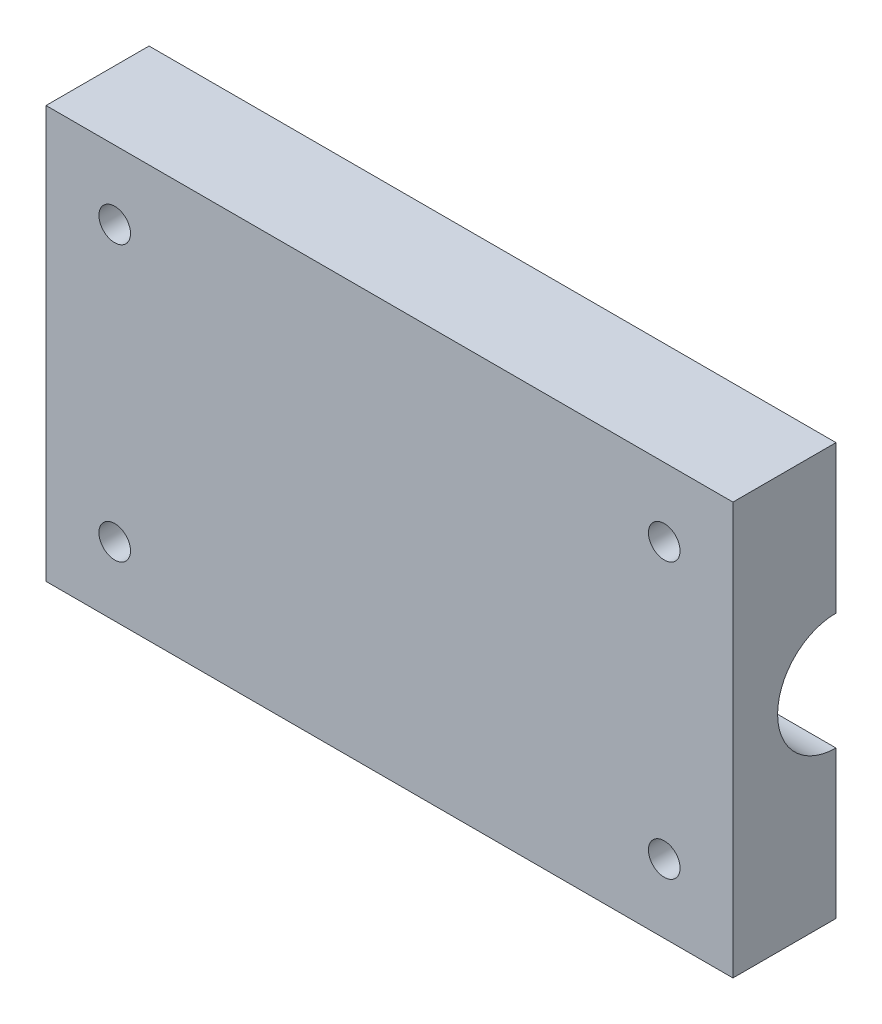
ISO-10303-21;
HEADER;
FILE_DESCRIPTION(('STEP AP214'),'2;1');
FILE_NAME('part.step','',(''),(''),'','','');
FILE_SCHEMA(('AUTOMOTIVE_DESIGN { 1 0 10303 214 1 1 1 1 }'));
ENDSEC;
DATA;
#1=APPLICATION_CONTEXT('core data for automotive mechanical design processes');
#2=APPLICATION_PROTOCOL_DEFINITION('international standard','automotive_design',2000,#1);
#3=PRODUCT_CONTEXT('',#1,'mechanical');
#4=PRODUCT('Part','Part','',(#3));
#5=PRODUCT_RELATED_PRODUCT_CATEGORY('part','',(#4));
#6=PRODUCT_DEFINITION_FORMATION('','',#4);
#7=PRODUCT_DEFINITION_CONTEXT('part definition',#1,'design');
#8=PRODUCT_DEFINITION('design','',#6,#7);
#9=PRODUCT_DEFINITION_SHAPE('','',#8);
#10=(LENGTH_UNIT() NAMED_UNIT(*) SI_UNIT(.MILLI.,.METRE.));
#11=(NAMED_UNIT(*) PLANE_ANGLE_UNIT() SI_UNIT($,.RADIAN.));
#12=(NAMED_UNIT(*) SI_UNIT($,.STERADIAN.) SOLID_ANGLE_UNIT());
#13=UNCERTAINTY_MEASURE_WITH_UNIT(LENGTH_MEASURE(1.E-05),#10,'distance_accuracy_value','');
#14=(GEOMETRIC_REPRESENTATION_CONTEXT(3) GLOBAL_UNCERTAINTY_ASSIGNED_CONTEXT((#13)) GLOBAL_UNIT_ASSIGNED_CONTEXT((#10,
#11,#12)) REPRESENTATION_CONTEXT('',''));
#15=CARTESIAN_POINT('',(0.,0.,0.));
#16=DIRECTION('',(0.,0.,1.));
#17=DIRECTION('',(1.,0.,0.));
#18=AXIS2_PLACEMENT_3D('',#15,#16,#17);
#19=CARTESIAN_POINT('',(0.,0.,0.));
#20=DIRECTION('',(0.,0.,1.));
#21=DIRECTION('',(1.,0.,0.));
#22=AXIS2_PLACEMENT_3D('',#19,#20,#21);
#23=PLANE('',#22);
#24=CARTESIAN_POINT('',(-40.,20.,0.));
#25=DIRECTION('',(0.,0.,1.));
#26=DIRECTION('',(-1.,0.,0.));
#27=AXIS2_PLACEMENT_3D('',#24,#25,#26);
#28=CIRCLE('',#27,2.3);
#29=CARTESIAN_POINT('',(-42.3,20.,0.));
#30=VERTEX_POINT('',#29);
#31=EDGE_CURVE('E189',#30,#30,#28,.T.);
#32=ORIENTED_EDGE('',*,*,#31,.T.);
#33=EDGE_LOOP('',(#32));
#34=FACE_BOUND('',#33,.T.);
#35=CARTESIAN_POINT('',(40.,20.,0.));
#36=DIRECTION('',(0.,0.,1.));
#37=DIRECTION('',(1.,0.,0.));
#38=AXIS2_PLACEMENT_3D('',#35,#36,#37);
#39=CIRCLE('',#38,2.3);
#40=CARTESIAN_POINT('',(42.3,20.,0.));
#41=VERTEX_POINT('',#40);
#42=EDGE_CURVE('E181',#41,#41,#39,.T.);
#43=ORIENTED_EDGE('',*,*,#42,.T.);
#44=EDGE_LOOP('',(#43));
#45=FACE_BOUND('',#44,.T.);
#46=DIRECTION('',(0.,1.,0.));
#47=VECTOR('',#46,1.);
#48=CARTESIAN_POINT('',(50.,30.,0.));
#49=LINE('',#48,#47);
#50=CARTESIAN_POINT('',(50.,8.5,0.));
#51=VERTEX_POINT('',#50);
#52=CARTESIAN_POINT('',(50.,30.,0.));
#53=VERTEX_POINT('',#52);
#54=EDGE_CURVE('E117',#51,#53,#49,.T.);
#55=ORIENTED_EDGE('',*,*,#54,.F.);
#56=DIRECTION('',(-1.,0.,0.));
#57=VECTOR('',#56,1.);
#58=CARTESIAN_POINT('',(150.,8.5,0.));
#59=LINE('',#58,#57);
#60=CARTESIAN_POINT('',(-50.,8.5,0.));
#61=VERTEX_POINT('',#60);
#62=EDGE_CURVE('E107',#51,#61,#59,.T.);
#63=ORIENTED_EDGE('',*,*,#62,.T.);
#64=DIRECTION('',(0.,-1.,0.));
#65=VECTOR('',#64,1.);
#66=CARTESIAN_POINT('',(-50.,30.,0.));
#67=LINE('',#66,#65);
#68=CARTESIAN_POINT('',(-50.,30.,0.));
#69=VERTEX_POINT('',#68);
#70=EDGE_CURVE('E116',#69,#61,#67,.T.);
#71=ORIENTED_EDGE('',*,*,#70,.F.);
#72=DIRECTION('',(-1.,0.,0.));
#73=VECTOR('',#72,1.);
#74=CARTESIAN_POINT('',(-50.,30.,0.));
#75=LINE('',#74,#73);
#76=EDGE_CURVE('E132',#53,#69,#75,.T.);
#77=ORIENTED_EDGE('',*,*,#76,.F.);
#78=EDGE_LOOP('',(#55,#63,#71,#77));
#79=FACE_BOUND('',#78,.T.);
#80=ADVANCED_FACE('F45',(#34,#45,#79),#23,.F.);
#81=CARTESIAN_POINT('',(0.,0.,15.));
#82=DIRECTION('',(0.,0.,1.));
#83=DIRECTION('',(1.,0.,0.));
#84=AXIS2_PLACEMENT_3D('',#81,#82,#83);
#85=PLANE('',#84);
#86=CARTESIAN_POINT('',(40.,20.,15.));
#87=DIRECTION('',(0.,0.,1.));
#88=DIRECTION('',(1.,0.,0.));
#89=AXIS2_PLACEMENT_3D('',#86,#87,#88);
#90=CIRCLE('',#89,2.3);
#91=CARTESIAN_POINT('',(42.3,20.,15.));
#92=VERTEX_POINT('',#91);
#93=EDGE_CURVE('E177',#92,#92,#90,.T.);
#94=ORIENTED_EDGE('',*,*,#93,.F.);
#95=EDGE_LOOP('',(#94));
#96=FACE_BOUND('',#95,.T.);
#97=CARTESIAN_POINT('',(-40.,-20.,15.));
#98=DIRECTION('',(0.,0.,1.));
#99=DIRECTION('',(1.,0.,0.));
#100=AXIS2_PLACEMENT_3D('',#97,#98,#99);
#101=CIRCLE('',#100,2.3);
#102=CARTESIAN_POINT('',(-37.7,-20.,15.));
#103=VERTEX_POINT('',#102);
#104=EDGE_CURVE('E151',#103,#103,#101,.T.);
#105=ORIENTED_EDGE('',*,*,#104,.F.);
#106=EDGE_LOOP('',(#105));
#107=FACE_BOUND('',#106,.T.);
#108=DIRECTION('',(0.,1.,0.));
#109=VECTOR('',#108,1.);
#110=CARTESIAN_POINT('',(50.,30.,15.));
#111=LINE('',#110,#109);
#112=CARTESIAN_POINT('',(50.,-30.,15.));
#113=VERTEX_POINT('',#112);
#114=CARTESIAN_POINT('',(50.,30.,15.));
#115=VERTEX_POINT('',#114);
#116=EDGE_CURVE('E130',#113,#115,#111,.T.);
#117=ORIENTED_EDGE('',*,*,#116,.T.);
#118=DIRECTION('',(-1.,0.,0.));
#119=VECTOR('',#118,1.);
#120=CARTESIAN_POINT('',(-50.,30.,15.));
#121=LINE('',#120,#119);
#122=CARTESIAN_POINT('',(-50.,30.,15.));
#123=VERTEX_POINT('',#122);
#124=EDGE_CURVE('E98',#115,#123,#121,.T.);
#125=ORIENTED_EDGE('',*,*,#124,.T.);
#126=DIRECTION('',(0.,-1.,0.));
#127=VECTOR('',#126,1.);
#128=CARTESIAN_POINT('',(-50.,30.,15.));
#129=LINE('',#128,#127);
#130=CARTESIAN_POINT('',(-50.,-30.,15.));
#131=VERTEX_POINT('',#130);
#132=EDGE_CURVE('E158',#123,#131,#129,.T.);
#133=ORIENTED_EDGE('',*,*,#132,.T.);
#134=DIRECTION('',(1.,0.,0.));
#135=VECTOR('',#134,1.);
#136=CARTESIAN_POINT('',(-50.,-30.,15.));
#137=LINE('',#136,#135);
#138=EDGE_CURVE('E69',#131,#113,#137,.T.);
#139=ORIENTED_EDGE('',*,*,#138,.T.);
#140=EDGE_LOOP('',(#117,#125,#133,#139));
#141=FACE_BOUND('',#140,.T.);
#142=CARTESIAN_POINT('',(40.,-20.,15.));
#143=DIRECTION('',(0.,0.,1.));
#144=DIRECTION('',(-1.,0.,0.));
#145=AXIS2_PLACEMENT_3D('',#142,#143,#144);
#146=CIRCLE('',#145,2.3);
#147=CARTESIAN_POINT('',(37.7,-20.,15.));
#148=VERTEX_POINT('',#147);
#149=EDGE_CURVE('E169',#148,#148,#146,.T.);
#150=ORIENTED_EDGE('',*,*,#149,.F.);
#151=EDGE_LOOP('',(#150));
#152=FACE_BOUND('',#151,.T.);
#153=CARTESIAN_POINT('',(-40.,20.,15.));
#154=DIRECTION('',(0.,0.,1.));
#155=DIRECTION('',(-1.,0.,0.));
#156=AXIS2_PLACEMENT_3D('',#153,#154,#155);
#157=CIRCLE('',#156,2.3);
#158=CARTESIAN_POINT('',(-42.3,20.,15.));
#159=VERTEX_POINT('',#158);
#160=EDGE_CURVE('E185',#159,#159,#157,.T.);
#161=ORIENTED_EDGE('',*,*,#160,.F.);
#162=EDGE_LOOP('',(#161));
#163=FACE_BOUND('',#162,.T.);
#164=ADVANCED_FACE('F218',(#96,#107,#141,#152,#163),#85,.T.);
#165=CARTESIAN_POINT('',(-50.,-8.5,0.));
#166=VERTEX_POINT('',#165);
#167=CARTESIAN_POINT('',(-50.,-30.,0.));
#168=VERTEX_POINT('',#167);
#169=EDGE_CURVE('E126',#166,#168,#67,.T.);
#170=ORIENTED_EDGE('',*,*,#169,.F.);
#171=DIRECTION('',(-1.,0.,0.));
#172=VECTOR('',#171,1.);
#173=CARTESIAN_POINT('',(150.,-8.5,0.));
#174=LINE('',#173,#172);
#175=CARTESIAN_POINT('',(50.,-8.5,0.));
#176=VERTEX_POINT('',#175);
#177=EDGE_CURVE('E61',#166,#176,#174,.F.);
#178=ORIENTED_EDGE('',*,*,#177,.T.);
#179=CARTESIAN_POINT('',(50.,-30.,0.));
#180=VERTEX_POINT('',#179);
#181=EDGE_CURVE('E150',#180,#176,#49,.T.);
#182=ORIENTED_EDGE('',*,*,#181,.F.);
#183=DIRECTION('',(1.,0.,0.));
#184=VECTOR('',#183,1.);
#185=CARTESIAN_POINT('',(-50.,-30.,0.));
#186=LINE('',#185,#184);
#187=EDGE_CURVE('E90',#168,#180,#186,.T.);
#188=ORIENTED_EDGE('',*,*,#187,.F.);
#189=EDGE_LOOP('',(#170,#178,#182,#188));
#190=FACE_BOUND('',#189,.T.);
#191=CARTESIAN_POINT('',(-40.,-20.,0.));
#192=DIRECTION('',(0.,0.,1.));
#193=DIRECTION('',(1.,0.,0.));
#194=AXIS2_PLACEMENT_3D('',#191,#192,#193);
#195=CIRCLE('',#194,2.3);
#196=CARTESIAN_POINT('',(-37.7,-20.,0.));
#197=VERTEX_POINT('',#196);
#198=EDGE_CURVE('E165',#197,#197,#195,.T.);
#199=ORIENTED_EDGE('',*,*,#198,.T.);
#200=EDGE_LOOP('',(#199));
#201=FACE_BOUND('',#200,.T.);
#202=CARTESIAN_POINT('',(40.,-20.,0.));
#203=DIRECTION('',(0.,0.,1.));
#204=DIRECTION('',(-1.,0.,0.));
#205=AXIS2_PLACEMENT_3D('',#202,#203,#204);
#206=CIRCLE('',#205,2.3);
#207=CARTESIAN_POINT('',(37.7,-20.,0.));
#208=VERTEX_POINT('',#207);
#209=EDGE_CURVE('E173',#208,#208,#206,.T.);
#210=ORIENTED_EDGE('',*,*,#209,.T.);
#211=EDGE_LOOP('',(#210));
#212=FACE_BOUND('',#211,.T.);
#213=ADVANCED_FACE('F200',(#190,#201,#212),#23,.F.);
#214=CARTESIAN_POINT('',(50.,30.,15.));
#215=DIRECTION('',(-1.,0.,0.));
#216=DIRECTION('',(0.,-1.,0.));
#217=AXIS2_PLACEMENT_3D('',#214,#215,#216);
#218=PLANE('',#217);
#219=ORIENTED_EDGE('',*,*,#181,.T.);
#220=CARTESIAN_POINT('',(50.,0.,0.));
#221=DIRECTION('',(-1.,0.,0.));
#222=DIRECTION('',(0.,-1.,0.));
#223=AXIS2_PLACEMENT_3D('',#220,#221,#222);
#224=CIRCLE('',#223,8.5);
#225=EDGE_CURVE('E119',#176,#51,#224,.T.);
#226=ORIENTED_EDGE('',*,*,#225,.T.);
#227=ORIENTED_EDGE('',*,*,#54,.T.);
#228=DIRECTION('',(0.,0.,-1.));
#229=VECTOR('',#228,1.);
#230=CARTESIAN_POINT('',(50.,30.,15.));
#231=LINE('',#230,#229);
#232=EDGE_CURVE('E54',#115,#53,#231,.T.);
#233=ORIENTED_EDGE('',*,*,#232,.F.);
#234=ORIENTED_EDGE('',*,*,#116,.F.);
#235=DIRECTION('',(0.,0.,-1.));
#236=VECTOR('',#235,1.);
#237=CARTESIAN_POINT('',(50.,-30.,15.));
#238=LINE('',#237,#236);
#239=EDGE_CURVE('E136',#113,#180,#238,.T.);
#240=ORIENTED_EDGE('',*,*,#239,.T.);
#241=EDGE_LOOP('',(#219,#226,#227,#233,#234,#240));
#242=FACE_BOUND('',#241,.T.);
#243=ADVANCED_FACE('F47',(#242),#218,.F.);
#244=CARTESIAN_POINT('',(-50.,30.,15.));
#245=DIRECTION('',(0.,-1.,0.));
#246=DIRECTION('',(0.,0.,-1.));
#247=AXIS2_PLACEMENT_3D('',#244,#245,#246);
#248=PLANE('',#247);
#249=ORIENTED_EDGE('',*,*,#76,.T.);
#250=DIRECTION('',(0.,0.,-1.));
#251=VECTOR('',#250,1.);
#252=CARTESIAN_POINT('',(-50.,30.,15.));
#253=LINE('',#252,#251);
#254=EDGE_CURVE('E124',#123,#69,#253,.T.);
#255=ORIENTED_EDGE('',*,*,#254,.F.);
#256=ORIENTED_EDGE('',*,*,#124,.F.);
#257=ORIENTED_EDGE('',*,*,#232,.T.);
#258=EDGE_LOOP('',(#249,#255,#256,#257));
#259=FACE_BOUND('',#258,.T.);
#260=ADVANCED_FACE('F145',(#259),#248,.F.);
#261=CARTESIAN_POINT('',(-50.,30.,15.));
#262=DIRECTION('',(1.,0.,0.));
#263=DIRECTION('',(0.,0.,-1.));
#264=AXIS2_PLACEMENT_3D('',#261,#262,#263);
#265=PLANE('',#264);
#266=ORIENTED_EDGE('',*,*,#70,.T.);
#267=CARTESIAN_POINT('',(-50.,0.,0.));
#268=DIRECTION('',(1.,0.,0.));
#269=DIRECTION('',(0.,0.,-1.));
#270=AXIS2_PLACEMENT_3D('',#267,#268,#269);
#271=CIRCLE('',#270,8.5);
#272=EDGE_CURVE('E11',#61,#166,#271,.T.);
#273=ORIENTED_EDGE('',*,*,#272,.T.);
#274=ORIENTED_EDGE('',*,*,#169,.T.);
#275=DIRECTION('',(0.,0.,-1.));
#276=VECTOR('',#275,1.);
#277=CARTESIAN_POINT('',(-50.,-30.,15.));
#278=LINE('',#277,#276);
#279=EDGE_CURVE('E139',#131,#168,#278,.T.);
#280=ORIENTED_EDGE('',*,*,#279,.F.);
#281=ORIENTED_EDGE('',*,*,#132,.F.);
#282=ORIENTED_EDGE('',*,*,#254,.T.);
#283=EDGE_LOOP('',(#266,#273,#274,#280,#281,#282));
#284=FACE_BOUND('',#283,.T.);
#285=ADVANCED_FACE('F122',(#284),#265,.F.);
#286=CARTESIAN_POINT('',(-50.,-30.,15.));
#287=DIRECTION('',(0.,1.,0.));
#288=DIRECTION('',(0.,0.,1.));
#289=AXIS2_PLACEMENT_3D('',#286,#287,#288);
#290=PLANE('',#289);
#291=ORIENTED_EDGE('',*,*,#187,.T.);
#292=ORIENTED_EDGE('',*,*,#239,.F.);
#293=ORIENTED_EDGE('',*,*,#138,.F.);
#294=ORIENTED_EDGE('',*,*,#279,.T.);
#295=EDGE_LOOP('',(#291,#292,#293,#294));
#296=FACE_BOUND('',#295,.T.);
#297=ADVANCED_FACE('F203',(#296),#290,.F.);
#298=CARTESIAN_POINT('',(-40.,-20.,15.));
#299=DIRECTION('',(0.,0.,-1.));
#300=DIRECTION('',(-1.,0.,0.));
#301=AXIS2_PLACEMENT_3D('',#298,#299,#300);
#302=CYLINDRICAL_SURFACE('',#301,2.3);
#303=ORIENTED_EDGE('',*,*,#104,.T.);
#304=EDGE_LOOP('',(#303));
#305=FACE_BOUND('',#304,.T.);
#306=ORIENTED_EDGE('',*,*,#198,.F.);
#307=EDGE_LOOP('',(#306));
#308=FACE_BOUND('',#307,.T.);
#309=ADVANCED_FACE('F205',(#305,#308),#302,.F.);
#310=CARTESIAN_POINT('',(40.,-20.,15.));
#311=DIRECTION('',(0.,0.,-1.));
#312=DIRECTION('',(-1.,0.,0.));
#313=AXIS2_PLACEMENT_3D('',#310,#311,#312);
#314=CYLINDRICAL_SURFACE('',#313,2.3);
#315=ORIENTED_EDGE('',*,*,#149,.T.);
#316=EDGE_LOOP('',(#315));
#317=FACE_BOUND('',#316,.T.);
#318=ORIENTED_EDGE('',*,*,#209,.F.);
#319=EDGE_LOOP('',(#318));
#320=FACE_BOUND('',#319,.T.);
#321=ADVANCED_FACE('F211',(#317,#320),#314,.F.);
#322=CARTESIAN_POINT('',(40.,20.,15.));
#323=DIRECTION('',(0.,0.,-1.));
#324=DIRECTION('',(-1.,0.,0.));
#325=AXIS2_PLACEMENT_3D('',#322,#323,#324);
#326=CYLINDRICAL_SURFACE('',#325,2.3);
#327=ORIENTED_EDGE('',*,*,#93,.T.);
#328=EDGE_LOOP('',(#327));
#329=FACE_BOUND('',#328,.T.);
#330=ORIENTED_EDGE('',*,*,#42,.F.);
#331=EDGE_LOOP('',(#330));
#332=FACE_BOUND('',#331,.T.);
#333=ADVANCED_FACE('F272',(#329,#332),#326,.F.);
#334=CARTESIAN_POINT('',(-40.,20.,15.));
#335=DIRECTION('',(0.,0.,-1.));
#336=DIRECTION('',(-1.,0.,0.));
#337=AXIS2_PLACEMENT_3D('',#334,#335,#336);
#338=CYLINDRICAL_SURFACE('',#337,2.3);
#339=ORIENTED_EDGE('',*,*,#160,.T.);
#340=EDGE_LOOP('',(#339));
#341=FACE_BOUND('',#340,.T.);
#342=ORIENTED_EDGE('',*,*,#31,.F.);
#343=EDGE_LOOP('',(#342));
#344=FACE_BOUND('',#343,.T.);
#345=ADVANCED_FACE('F281',(#341,#344),#338,.F.);
#346=CARTESIAN_POINT('',(150.,0.,0.));
#347=DIRECTION('',(-1.,0.,0.));
#348=DIRECTION('',(0.,0.,1.));
#349=AXIS2_PLACEMENT_3D('',#346,#347,#348);
#350=CYLINDRICAL_SURFACE('',#349,8.5);
#351=ORIENTED_EDGE('',*,*,#177,.F.);
#352=ORIENTED_EDGE('',*,*,#272,.F.);
#353=ORIENTED_EDGE('',*,*,#62,.F.);
#354=ORIENTED_EDGE('',*,*,#225,.F.);
#355=EDGE_LOOP('',(#351,#352,#353,#354));
#356=FACE_BOUND('',#355,.T.);
#357=ADVANCED_FACE('F106',(#356),#350,.F.);
#358=CLOSED_SHELL('',(#80,#164,#213,#243,#260,#285,#297,#309,#321,#333,#345,#357));
#359=MANIFOLD_SOLID_BREP('B2',#358);
#360=ADVANCED_BREP_SHAPE_REPRESENTATION('',(#18,#359),#14);
#361=SHAPE_DEFINITION_REPRESENTATION(#9,#360);
ENDSEC;
END-ISO-10303-21;
